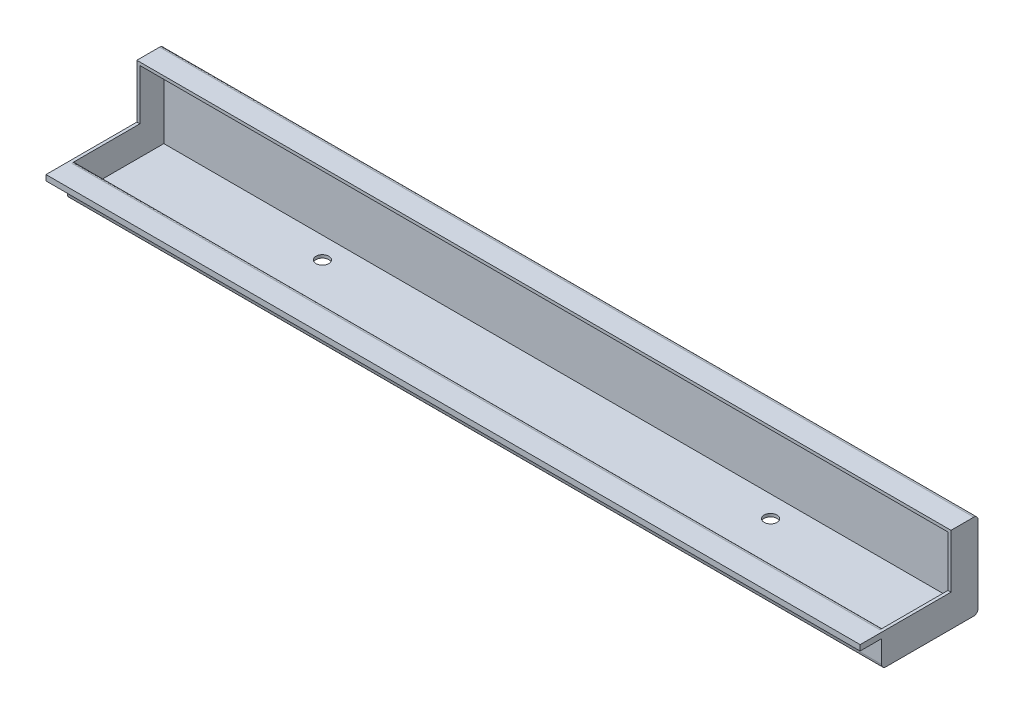
ISO-10303-21;
HEADER;
FILE_DESCRIPTION(('STEP AP214'),'2;1');
FILE_NAME('part.step','',(''),(''),'','','');
FILE_SCHEMA(('AUTOMOTIVE_DESIGN { 1 0 10303 214 1 1 1 1 }'));
ENDSEC;
DATA;
#1=APPLICATION_CONTEXT('core data for automotive mechanical design processes');
#2=APPLICATION_PROTOCOL_DEFINITION('international standard','automotive_design',2000,#1);
#3=PRODUCT_CONTEXT('',#1,'mechanical');
#4=PRODUCT('Part','Part','',(#3));
#5=PRODUCT_RELATED_PRODUCT_CATEGORY('part','',(#4));
#6=PRODUCT_DEFINITION_FORMATION('','',#4);
#7=PRODUCT_DEFINITION_CONTEXT('part definition',#1,'design');
#8=PRODUCT_DEFINITION('design','',#6,#7);
#9=PRODUCT_DEFINITION_SHAPE('','',#8);
#10=(LENGTH_UNIT() NAMED_UNIT(*) SI_UNIT(.MILLI.,.METRE.));
#11=(NAMED_UNIT(*) PLANE_ANGLE_UNIT() SI_UNIT($,.RADIAN.));
#12=(NAMED_UNIT(*) SI_UNIT($,.STERADIAN.) SOLID_ANGLE_UNIT());
#13=UNCERTAINTY_MEASURE_WITH_UNIT(LENGTH_MEASURE(1.E-05),#10,'distance_accuracy_value','');
#14=(GEOMETRIC_REPRESENTATION_CONTEXT(3) GLOBAL_UNCERTAINTY_ASSIGNED_CONTEXT((#13)) GLOBAL_UNIT_ASSIGNED_CONTEXT((#10,
#11,#12)) REPRESENTATION_CONTEXT('',''));
#15=CARTESIAN_POINT('',(0.,0.,0.));
#16=DIRECTION('',(0.,0.,1.));
#17=DIRECTION('',(1.,0.,0.));
#18=AXIS2_PLACEMENT_3D('',#15,#16,#17);
#19=CARTESIAN_POINT('',(0.,-23.622,0.));
#20=DIRECTION('',(0.,1.,0.));
#21=DIRECTION('',(0.,0.,1.));
#22=AXIS2_PLACEMENT_3D('',#19,#20,#21);
#23=PLANE('',#22);
#24=CARTESIAN_POINT('',(132.842,-23.622,14.4780000000006));
#25=DIRECTION('',(0.,-1.,0.));
#26=DIRECTION('',(0.,0.,-1.));
#27=AXIS2_PLACEMENT_3D('',#24,#25,#26);
#28=CIRCLE('',#27,3.81000000000002);
#29=CARTESIAN_POINT('',(132.842,-23.622,10.6680000000006));
#30=VERTEX_POINT('',#29);
#31=EDGE_CURVE('E297',#30,#30,#28,.T.);
#32=ORIENTED_EDGE('',*,*,#31,.T.);
#33=EDGE_LOOP('',(#32));
#34=FACE_BOUND('',#33,.T.);
#35=DIRECTION('',(1.,0.,0.));
#36=VECTOR('',#35,1.);
#37=CARTESIAN_POINT('',(0.,-23.622,53.848));
#38=LINE('',#37,#36);
#39=CARTESIAN_POINT('',(-239.522,-23.622,53.848));
#40=VERTEX_POINT('',#39);
#41=CARTESIAN_POINT('',(239.522,-23.6220000000009,53.848));
#42=VERTEX_POINT('',#41);
#43=EDGE_CURVE('E189',#40,#42,#38,.T.);
#44=ORIENTED_EDGE('',*,*,#43,.T.);
#45=DIRECTION('',(0.,0.,-1.));
#46=VECTOR('',#45,1.);
#47=CARTESIAN_POINT('',(239.522,-23.622,69.85));
#48=LINE('',#47,#46);
#49=CARTESIAN_POINT('',(239.522,-23.622,1.778));
#50=VERTEX_POINT('',#49);
#51=EDGE_CURVE('E170',#42,#50,#48,.T.);
#52=ORIENTED_EDGE('',*,*,#51,.T.);
#53=DIRECTION('',(1.,0.,0.));
#54=VECTOR('',#53,1.);
#55=CARTESIAN_POINT('',(0.,-23.622,1.778));
#56=LINE('',#55,#54);
#57=CARTESIAN_POINT('',(-239.522,-23.622,1.778));
#58=VERTEX_POINT('',#57);
#59=EDGE_CURVE('E183',#58,#50,#56,.T.);
#60=ORIENTED_EDGE('',*,*,#59,.F.);
#61=DIRECTION('',(0.,0.,-1.));
#62=VECTOR('',#61,1.);
#63=CARTESIAN_POINT('',(-239.522,-23.622,69.85));
#64=LINE('',#63,#62);
#65=EDGE_CURVE('E182',#40,#58,#64,.T.);
#66=ORIENTED_EDGE('',*,*,#65,.F.);
#67=EDGE_LOOP('',(#44,#52,#60,#66));
#68=FACE_BOUND('',#67,.T.);
#69=CARTESIAN_POINT('',(-132.842,-23.622,14.478));
#70=DIRECTION('',(0.,1.,0.));
#71=DIRECTION('',(0.,0.,1.));
#72=AXIS2_PLACEMENT_3D('',#69,#70,#71);
#73=CIRCLE('',#72,3.81000000000001);
#74=CARTESIAN_POINT('',(-132.842,-23.622,18.288));
#75=VERTEX_POINT('',#74);
#76=EDGE_CURVE('E290',#75,#75,#73,.T.);
#77=ORIENTED_EDGE('',*,*,#76,.F.);
#78=EDGE_LOOP('',(#77));
#79=FACE_BOUND('',#78,.T.);
#80=ADVANCED_FACE('F41',(#34,#68,#79),#23,.T.);
#81=CARTESIAN_POINT('',(-241.3,-25.4,69.85));
#82=DIRECTION('',(0.,1.,0.));
#83=DIRECTION('',(0.,0.,1.));
#84=AXIS2_PLACEMENT_3D('',#81,#82,#83);
#85=PLANE('',#84);
#86=DIRECTION('',(0.,0.,-1.));
#87=VECTOR('',#86,1.);
#88=CARTESIAN_POINT('',(241.3,-25.4,69.85));
#89=LINE('',#88,#87);
#90=CARTESIAN_POINT('',(241.3,-25.4,54.61));
#91=VERTEX_POINT('',#90);
#92=CARTESIAN_POINT('',(241.3,-25.4,2.54));
#93=VERTEX_POINT('',#92);
#94=EDGE_CURVE('E223',#91,#93,#89,.T.);
#95=ORIENTED_EDGE('',*,*,#94,.F.);
#96=DIRECTION('',(1.,0.,0.));
#97=VECTOR('',#96,1.);
#98=CARTESIAN_POINT('',(-241.3,-25.4,54.61));
#99=LINE('',#98,#97);
#100=CARTESIAN_POINT('',(-241.3,-25.4,54.61));
#101=VERTEX_POINT('',#100);
#102=EDGE_CURVE('E266',#91,#101,#99,.F.);
#103=ORIENTED_EDGE('',*,*,#102,.T.);
#104=DIRECTION('',(0.,0.,-1.));
#105=VECTOR('',#104,1.);
#106=CARTESIAN_POINT('',(-241.3,-25.4,69.85));
#107=LINE('',#106,#105);
#108=CARTESIAN_POINT('',(-241.3,-25.4,2.54));
#109=VERTEX_POINT('',#108);
#110=EDGE_CURVE('E232',#101,#109,#107,.T.);
#111=ORIENTED_EDGE('',*,*,#110,.T.);
#112=DIRECTION('',(1.,0.,0.));
#113=VECTOR('',#112,1.);
#114=CARTESIAN_POINT('',(241.3,-25.4,2.54));
#115=LINE('',#114,#113);
#116=EDGE_CURVE('E262',#109,#93,#115,.T.);
#117=ORIENTED_EDGE('',*,*,#116,.T.);
#118=EDGE_LOOP('',(#95,#103,#111,#117));
#119=FACE_BOUND('',#118,.T.);
#120=CARTESIAN_POINT('',(132.842,-25.4,14.4780000000006));
#121=DIRECTION('',(0.,1.,0.));
#122=DIRECTION('',(0.,0.,1.));
#123=AXIS2_PLACEMENT_3D('',#120,#121,#122);
#124=CIRCLE('',#123,3.81000000000002);
#125=CARTESIAN_POINT('',(132.842,-25.4,18.2880000000006));
#126=VERTEX_POINT('',#125);
#127=EDGE_CURVE('E287',#126,#126,#124,.F.);
#128=ORIENTED_EDGE('',*,*,#127,.F.);
#129=EDGE_LOOP('',(#128));
#130=FACE_BOUND('',#129,.T.);
#131=CARTESIAN_POINT('',(-132.842,-25.4,14.478));
#132=DIRECTION('',(0.,1.,0.));
#133=DIRECTION('',(0.,0.,1.));
#134=AXIS2_PLACEMENT_3D('',#131,#132,#133);
#135=CIRCLE('',#134,3.81000000000001);
#136=CARTESIAN_POINT('',(-132.842,-25.4,18.288));
#137=VERTEX_POINT('',#136);
#138=EDGE_CURVE('E45',#137,#137,#135,.T.);
#139=ORIENTED_EDGE('',*,*,#138,.T.);
#140=EDGE_LOOP('',(#139));
#141=FACE_BOUND('',#140,.T.);
#142=ADVANCED_FACE('F406',(#119,#130,#141),#85,.F.);
#143=CARTESIAN_POINT('',(0.,-23.622,53.848));
#144=DIRECTION('',(0.,0.,1.));
#145=DIRECTION('',(1.,0.,0.));
#146=AXIS2_PLACEMENT_3D('',#143,#144,#145);
#147=PLANE('',#146);
#148=DIRECTION('',(0.,1.,0.));
#149=VECTOR('',#148,1.);
#150=CARTESIAN_POINT('',(-239.522,0.,53.848));
#151=LINE('',#150,#149);
#152=CARTESIAN_POINT('',(-239.522,-8.89,53.848));
#153=VERTEX_POINT('',#152);
#154=EDGE_CURVE('E309',#40,#153,#151,.T.);
#155=ORIENTED_EDGE('',*,*,#154,.T.);
#156=DIRECTION('',(-1.,0.,0.));
#157=VECTOR('',#156,1.);
#158=CARTESIAN_POINT('',(239.522,-8.89,53.848));
#159=LINE('',#158,#157);
#160=CARTESIAN_POINT('',(239.522,-8.89,53.848));
#161=VERTEX_POINT('',#160);
#162=EDGE_CURVE('E191',#153,#161,#159,.F.);
#163=ORIENTED_EDGE('',*,*,#162,.T.);
#164=DIRECTION('',(0.,1.,0.));
#165=VECTOR('',#164,1.);
#166=CARTESIAN_POINT('',(239.522,-23.6220000000009,53.848));
#167=LINE('',#166,#165);
#168=EDGE_CURVE('E173',#42,#161,#167,.T.);
#169=ORIENTED_EDGE('',*,*,#168,.F.);
#170=ORIENTED_EDGE('',*,*,#43,.F.);
#171=EDGE_LOOP('',(#155,#163,#169,#170));
#172=FACE_BOUND('',#171,.T.);
#173=ADVANCED_FACE('F188',(#172),#147,.F.);
#174=CARTESIAN_POINT('',(0.,-23.622,16.002));
#175=DIRECTION('',(0.,0.,1.));
#176=DIRECTION('',(1.,0.,0.));
#177=AXIS2_PLACEMENT_3D('',#174,#175,#176);
#178=PLANE('',#177);
#179=DIRECTION('',(-1.,0.,0.));
#180=VECTOR('',#179,1.);
#181=CARTESIAN_POINT('',(0.,-6.34999999999999,16.002));
#182=LINE('',#181,#180);
#183=CARTESIAN_POINT('',(241.3,-6.35000000000093,16.002));
#184=VERTEX_POINT('',#183);
#185=CARTESIAN_POINT('',(239.522,-6.35000000000092,16.002));
#186=VERTEX_POINT('',#185);
#187=EDGE_CURVE('E193',#184,#186,#182,.T.);
#188=ORIENTED_EDGE('',*,*,#187,.F.);
#189=DIRECTION('',(0.,1.,0.));
#190=VECTOR('',#189,1.);
#191=CARTESIAN_POINT('',(241.3,-23.622,16.002));
#192=LINE('',#191,#190);
#193=CARTESIAN_POINT('',(241.3,25.4,16.002));
#194=VERTEX_POINT('',#193);
#195=EDGE_CURVE('E199',#184,#194,#192,.T.);
#196=ORIENTED_EDGE('',*,*,#195,.T.);
#197=DIRECTION('',(1.,0.,0.));
#198=VECTOR('',#197,1.);
#199=CARTESIAN_POINT('',(0.,25.4,16.002));
#200=LINE('',#199,#198);
#201=CARTESIAN_POINT('',(-241.3,25.4,16.002));
#202=VERTEX_POINT('',#201);
#203=EDGE_CURVE('E200',#202,#194,#200,.T.);
#204=ORIENTED_EDGE('',*,*,#203,.F.);
#205=DIRECTION('',(0.,1.,0.));
#206=VECTOR('',#205,1.);
#207=CARTESIAN_POINT('',(-241.3,-23.622,16.002));
#208=LINE('',#207,#206);
#209=CARTESIAN_POINT('',(-241.3,-6.34999999999999,16.002));
#210=VERTEX_POINT('',#209);
#211=EDGE_CURVE('E204',#210,#202,#208,.T.);
#212=ORIENTED_EDGE('',*,*,#211,.F.);
#213=DIRECTION('',(1.,0.,0.));
#214=VECTOR('',#213,1.);
#215=CARTESIAN_POINT('',(0.,-6.34999999999999,16.002));
#216=LINE('',#215,#214);
#217=CARTESIAN_POINT('',(-239.522,-6.34999999999999,16.002));
#218=VERTEX_POINT('',#217);
#219=EDGE_CURVE('E315',#210,#218,#216,.T.);
#220=ORIENTED_EDGE('',*,*,#219,.T.);
#221=DIRECTION('',(0.,1.,0.));
#222=VECTOR('',#221,1.);
#223=CARTESIAN_POINT('',(-239.522,-23.622,16.002));
#224=LINE('',#223,#222);
#225=CARTESIAN_POINT('',(-239.522,23.622,16.002));
#226=VERTEX_POINT('',#225);
#227=EDGE_CURVE('E323',#218,#226,#224,.T.);
#228=ORIENTED_EDGE('',*,*,#227,.T.);
#229=DIRECTION('',(1.,0.,0.));
#230=VECTOR('',#229,1.);
#231=CARTESIAN_POINT('',(0.,23.622,16.002));
#232=LINE('',#231,#230);
#233=CARTESIAN_POINT('',(239.522,23.622,16.002));
#234=VERTEX_POINT('',#233);
#235=EDGE_CURVE('E318',#226,#234,#232,.T.);
#236=ORIENTED_EDGE('',*,*,#235,.T.);
#237=DIRECTION('',(0.,1.,0.));
#238=VECTOR('',#237,1.);
#239=CARTESIAN_POINT('',(239.522,-25.4,16.002));
#240=LINE('',#239,#238);
#241=EDGE_CURVE('E342',#186,#234,#240,.T.);
#242=ORIENTED_EDGE('',*,*,#241,.F.);
#243=EDGE_LOOP('',(#188,#196,#204,#212,#220,#228,#236,#242));
#244=FACE_BOUND('',#243,.T.);
#245=ADVANCED_FACE('F387',(#244),#178,.T.);
#246=CARTESIAN_POINT('',(241.3,-25.4,69.85));
#247=DIRECTION('',(-1.,0.,0.));
#248=DIRECTION('',(0.,0.,1.));
#249=AXIS2_PLACEMENT_3D('',#246,#247,#248);
#250=PLANE('',#249);
#251=DIRECTION('',(0.,1.,0.));
#252=VECTOR('',#251,1.);
#253=CARTESIAN_POINT('',(241.3,-25.4,57.15));
#254=LINE('',#253,#252);
#255=CARTESIAN_POINT('',(241.3,-22.86,57.15));
#256=VERTEX_POINT('',#255);
#257=CARTESIAN_POINT('',(241.3,-9.65199999999999,57.15));
#258=VERTEX_POINT('',#257);
#259=EDGE_CURVE('E354',#256,#258,#254,.T.);
#260=ORIENTED_EDGE('',*,*,#259,.F.);
#261=CARTESIAN_POINT('',(241.3,-22.86,54.61));
#262=DIRECTION('',(-1.,0.,0.));
#263=DIRECTION('',(0.,0.,1.));
#264=AXIS2_PLACEMENT_3D('',#261,#262,#263);
#265=CIRCLE('',#264,2.54);
#266=EDGE_CURVE('E259',#256,#91,#265,.F.);
#267=ORIENTED_EDGE('',*,*,#266,.T.);
#268=ORIENTED_EDGE('',*,*,#94,.T.);
#269=CARTESIAN_POINT('',(241.3,-22.86,2.54));
#270=DIRECTION('',(-1.,0.,0.));
#271=DIRECTION('',(0.,0.,1.));
#272=AXIS2_PLACEMENT_3D('',#269,#270,#271);
#273=CIRCLE('',#272,2.54);
#274=CARTESIAN_POINT('',(241.3,-22.86,0.));
#275=VERTEX_POINT('',#274);
#276=EDGE_CURVE('E256',#93,#275,#273,.F.);
#277=ORIENTED_EDGE('',*,*,#276,.T.);
#278=DIRECTION('',(0.,1.,0.));
#279=VECTOR('',#278,1.);
#280=CARTESIAN_POINT('',(241.3,-25.4,0.));
#281=LINE('',#280,#279);
#282=CARTESIAN_POINT('',(241.3,22.86,0.));
#283=VERTEX_POINT('',#282);
#284=EDGE_CURVE('E213',#275,#283,#281,.T.);
#285=ORIENTED_EDGE('',*,*,#284,.T.);
#286=CARTESIAN_POINT('',(241.3,22.86,2.54));
#287=DIRECTION('',(-1.,0.,0.));
#288=DIRECTION('',(0.,0.,1.));
#289=AXIS2_PLACEMENT_3D('',#286,#287,#288);
#290=CIRCLE('',#289,2.54);
#291=CARTESIAN_POINT('',(241.3,25.4,2.54));
#292=VERTEX_POINT('',#291);
#293=EDGE_CURVE('E253',#283,#292,#290,.F.);
#294=ORIENTED_EDGE('',*,*,#293,.T.);
#295=DIRECTION('',(0.,0.,-1.));
#296=VECTOR('',#295,1.);
#297=CARTESIAN_POINT('',(241.3,25.4,69.85));
#298=LINE('',#297,#296);
#299=EDGE_CURVE('E239',#194,#292,#298,.T.);
#300=ORIENTED_EDGE('',*,*,#299,.F.);
#301=ORIENTED_EDGE('',*,*,#195,.F.);
#302=DIRECTION('',(0.,0.,-1.));
#303=VECTOR('',#302,1.);
#304=CARTESIAN_POINT('',(241.3,-6.34999999999999,53.848));
#305=LINE('',#304,#303);
#306=CARTESIAN_POINT('',(241.3,-6.34999999999999,69.85));
#307=VERTEX_POINT('',#306);
#308=EDGE_CURVE('E207',#307,#184,#305,.T.);
#309=ORIENTED_EDGE('',*,*,#308,.F.);
#310=DIRECTION('',(0.,1.,0.));
#311=VECTOR('',#310,1.);
#312=CARTESIAN_POINT('',(241.3,-25.4,69.85));
#313=LINE('',#312,#311);
#314=CARTESIAN_POINT('',(241.3,-9.65199999999999,69.85));
#315=VERTEX_POINT('',#314);
#316=EDGE_CURVE('E215',#315,#307,#313,.T.);
#317=ORIENTED_EDGE('',*,*,#316,.F.);
#318=DIRECTION('',(0.,0.,1.));
#319=VECTOR('',#318,1.);
#320=CARTESIAN_POINT('',(241.3,-9.65199999999999,57.15));
#321=LINE('',#320,#319);
#322=EDGE_CURVE('E361',#258,#315,#321,.T.);
#323=ORIENTED_EDGE('',*,*,#322,.F.);
#324=EDGE_LOOP('',(#260,#267,#268,#277,#285,#294,#300,#301,#309,#317,#323));
#325=FACE_BOUND('',#324,.T.);
#326=ADVANCED_FACE('F391',(#325),#250,.F.);
#327=CARTESIAN_POINT('',(-241.3,-25.4,69.85));
#328=DIRECTION('',(1.,0.,0.));
#329=DIRECTION('',(0.,0.,-1.));
#330=AXIS2_PLACEMENT_3D('',#327,#328,#329);
#331=PLANE('',#330);
#332=ORIENTED_EDGE('',*,*,#110,.F.);
#333=CARTESIAN_POINT('',(-241.3,-22.86,54.61));
#334=DIRECTION('',(1.,0.,0.));
#335=DIRECTION('',(0.,0.,-1.));
#336=AXIS2_PLACEMENT_3D('',#333,#334,#335);
#337=CIRCLE('',#336,2.54);
#338=CARTESIAN_POINT('',(-241.3,-22.86,57.15));
#339=VERTEX_POINT('',#338);
#340=EDGE_CURVE('E274',#101,#339,#337,.F.);
#341=ORIENTED_EDGE('',*,*,#340,.T.);
#342=DIRECTION('',(0.,-1.,0.));
#343=VECTOR('',#342,1.);
#344=CARTESIAN_POINT('',(-241.3,-25.4,57.15));
#345=LINE('',#344,#343);
#346=CARTESIAN_POINT('',(-241.3,-9.65199999999999,57.15));
#347=VERTEX_POINT('',#346);
#348=EDGE_CURVE('E350',#347,#339,#345,.T.);
#349=ORIENTED_EDGE('',*,*,#348,.F.);
#350=DIRECTION('',(0.,0.,1.));
#351=VECTOR('',#350,1.);
#352=CARTESIAN_POINT('',(-241.3,-9.65199999999999,57.15));
#353=LINE('',#352,#351);
#354=CARTESIAN_POINT('',(-241.3,-9.65199999999999,69.85));
#355=VERTEX_POINT('',#354);
#356=EDGE_CURVE('E364',#347,#355,#353,.T.);
#357=ORIENTED_EDGE('',*,*,#356,.T.);
#358=DIRECTION('',(0.,-1.,0.));
#359=VECTOR('',#358,1.);
#360=CARTESIAN_POINT('',(-241.3,-25.4,69.85));
#361=LINE('',#360,#359);
#362=CARTESIAN_POINT('',(-241.3,-6.34999999999999,69.85));
#363=VERTEX_POINT('',#362);
#364=EDGE_CURVE('E218',#363,#355,#361,.T.);
#365=ORIENTED_EDGE('',*,*,#364,.F.);
#366=DIRECTION('',(0.,0.,1.));
#367=VECTOR('',#366,1.);
#368=CARTESIAN_POINT('',(-241.3,-6.34999999999999,53.848));
#369=LINE('',#368,#367);
#370=EDGE_CURVE('E368',#210,#363,#369,.T.);
#371=ORIENTED_EDGE('',*,*,#370,.F.);
#372=ORIENTED_EDGE('',*,*,#211,.T.);
#373=DIRECTION('',(0.,0.,-1.));
#374=VECTOR('',#373,1.);
#375=CARTESIAN_POINT('',(-241.3,25.4,69.85));
#376=LINE('',#375,#374);
#377=CARTESIAN_POINT('',(-241.3,25.4,2.54));
#378=VERTEX_POINT('',#377);
#379=EDGE_CURVE('E236',#202,#378,#376,.T.);
#380=ORIENTED_EDGE('',*,*,#379,.T.);
#381=CARTESIAN_POINT('',(-241.3,22.86,2.54));
#382=DIRECTION('',(1.,0.,0.));
#383=DIRECTION('',(0.,0.,-1.));
#384=AXIS2_PLACEMENT_3D('',#381,#382,#383);
#385=CIRCLE('',#384,2.54);
#386=CARTESIAN_POINT('',(-241.3,22.86,0.));
#387=VERTEX_POINT('',#386);
#388=EDGE_CURVE('E66',#378,#387,#385,.F.);
#389=ORIENTED_EDGE('',*,*,#388,.T.);
#390=DIRECTION('',(0.,-1.,0.));
#391=VECTOR('',#390,1.);
#392=CARTESIAN_POINT('',(-241.3,-25.4,0.));
#393=LINE('',#392,#391);
#394=CARTESIAN_POINT('',(-241.3,-22.86,0.));
#395=VERTEX_POINT('',#394);
#396=EDGE_CURVE('E219',#387,#395,#393,.T.);
#397=ORIENTED_EDGE('',*,*,#396,.T.);
#398=CARTESIAN_POINT('',(-241.3,-22.86,2.54));
#399=DIRECTION('',(1.,0.,0.));
#400=DIRECTION('',(0.,0.,-1.));
#401=AXIS2_PLACEMENT_3D('',#398,#399,#400);
#402=CIRCLE('',#401,2.54);
#403=EDGE_CURVE('E271',#395,#109,#402,.F.);
#404=ORIENTED_EDGE('',*,*,#403,.T.);
#405=EDGE_LOOP('',(#332,#341,#349,#357,#365,#371,#372,#380,#389,#397,#404));
#406=FACE_BOUND('',#405,.T.);
#407=ADVANCED_FACE('F411',(#406),#331,.F.);
#408=CARTESIAN_POINT('',(0.,0.,69.85));
#409=DIRECTION('',(0.,0.,-1.));
#410=DIRECTION('',(-1.,0.,0.));
#411=AXIS2_PLACEMENT_3D('',#408,#409,#410);
#412=PLANE('',#411);
#413=ORIENTED_EDGE('',*,*,#364,.T.);
#414=DIRECTION('',(-1.,0.,0.));
#415=VECTOR('',#414,1.);
#416=CARTESIAN_POINT('',(-241.3,-9.65199999999999,69.85));
#417=LINE('',#416,#415);
#418=EDGE_CURVE('E327',#315,#355,#417,.T.);
#419=ORIENTED_EDGE('',*,*,#418,.F.);
#420=ORIENTED_EDGE('',*,*,#316,.T.);
#421=DIRECTION('',(1.,0.,0.));
#422=VECTOR('',#421,1.);
#423=CARTESIAN_POINT('',(-241.3,-6.34999999999999,69.85));
#424=LINE('',#423,#422);
#425=EDGE_CURVE('E372',#363,#307,#424,.T.);
#426=ORIENTED_EDGE('',*,*,#425,.F.);
#427=EDGE_LOOP('',(#413,#419,#420,#426));
#428=FACE_BOUND('',#427,.T.);
#429=ADVANCED_FACE('F424',(#428),#412,.F.);
#430=CARTESIAN_POINT('',(-241.3,25.4,69.85));
#431=DIRECTION('',(0.,-1.,0.));
#432=DIRECTION('',(0.,0.,-1.));
#433=AXIS2_PLACEMENT_3D('',#430,#431,#432);
#434=PLANE('',#433);
#435=ORIENTED_EDGE('',*,*,#299,.T.);
#436=DIRECTION('',(-1.,0.,0.));
#437=VECTOR('',#436,1.);
#438=CARTESIAN_POINT('',(-241.3,25.4,2.54));
#439=LINE('',#438,#437);
#440=EDGE_CURVE('E282',#292,#378,#439,.T.);
#441=ORIENTED_EDGE('',*,*,#440,.T.);
#442=ORIENTED_EDGE('',*,*,#379,.F.);
#443=ORIENTED_EDGE('',*,*,#203,.T.);
#444=EDGE_LOOP('',(#435,#441,#442,#443));
#445=FACE_BOUND('',#444,.T.);
#446=ADVANCED_FACE('F395',(#445),#434,.F.);
#447=CARTESIAN_POINT('',(0.,0.,0.));
#448=DIRECTION('',(0.,0.,-1.));
#449=DIRECTION('',(-1.,0.,0.));
#450=AXIS2_PLACEMENT_3D('',#447,#448,#449);
#451=PLANE('',#450);
#452=ORIENTED_EDGE('',*,*,#284,.F.);
#453=DIRECTION('',(1.,0.,0.));
#454=VECTOR('',#453,1.);
#455=CARTESIAN_POINT('',(-241.3,-22.86,0.));
#456=LINE('',#455,#454);
#457=EDGE_CURVE('E59',#275,#395,#456,.F.);
#458=ORIENTED_EDGE('',*,*,#457,.T.);
#459=ORIENTED_EDGE('',*,*,#396,.F.);
#460=DIRECTION('',(-1.,0.,0.));
#461=VECTOR('',#460,1.);
#462=CARTESIAN_POINT('',(241.3,22.86,0.));
#463=LINE('',#462,#461);
#464=EDGE_CURVE('E277',#387,#283,#463,.F.);
#465=ORIENTED_EDGE('',*,*,#464,.T.);
#466=EDGE_LOOP('',(#452,#458,#459,#465));
#467=FACE_BOUND('',#466,.T.);
#468=ADVANCED_FACE('F399',(#467),#451,.T.);
#469=CARTESIAN_POINT('',(0.,-6.34999999999999,0.));
#470=DIRECTION('',(0.,1.,0.));
#471=DIRECTION('',(0.,0.,1.));
#472=AXIS2_PLACEMENT_3D('',#469,#470,#471);
#473=PLANE('',#472);
#474=DIRECTION('',(-1.,0.,0.));
#475=VECTOR('',#474,1.);
#476=CARTESIAN_POINT('',(-239.522,-6.34999999999999,56.388));
#477=LINE('',#476,#475);
#478=CARTESIAN_POINT('',(239.522,-6.35000000000092,56.388));
#479=VERTEX_POINT('',#478);
#480=CARTESIAN_POINT('',(-239.522,-6.34999999999999,56.388));
#481=VERTEX_POINT('',#480);
#482=EDGE_CURVE('E243',#479,#481,#477,.T.);
#483=ORIENTED_EDGE('',*,*,#482,.T.);
#484=DIRECTION('',(0.,0.,1.));
#485=VECTOR('',#484,1.);
#486=CARTESIAN_POINT('',(-239.522,-6.34999999999999,9.398));
#487=LINE('',#486,#485);
#488=EDGE_CURVE('E312',#218,#481,#487,.T.);
#489=ORIENTED_EDGE('',*,*,#488,.F.);
#490=ORIENTED_EDGE('',*,*,#219,.F.);
#491=ORIENTED_EDGE('',*,*,#370,.T.);
#492=ORIENTED_EDGE('',*,*,#425,.T.);
#493=ORIENTED_EDGE('',*,*,#308,.T.);
#494=ORIENTED_EDGE('',*,*,#187,.T.);
#495=DIRECTION('',(0.,0.,1.));
#496=VECTOR('',#495,1.);
#497=CARTESIAN_POINT('',(239.522,-6.35000000000092,9.398));
#498=LINE('',#497,#496);
#499=EDGE_CURVE('E194',#186,#479,#498,.T.);
#500=ORIENTED_EDGE('',*,*,#499,.T.);
#501=EDGE_LOOP('',(#483,#489,#490,#491,#492,#493,#494,#500));
#502=FACE_BOUND('',#501,.T.);
#503=ADVANCED_FACE('F380',(#502),#473,.T.);
#504=CARTESIAN_POINT('',(-241.3,-9.65199999999999,57.15));
#505=DIRECTION('',(0.,1.,0.));
#506=DIRECTION('',(0.,0.,1.));
#507=AXIS2_PLACEMENT_3D('',#504,#505,#506);
#508=PLANE('',#507);
#509=ORIENTED_EDGE('',*,*,#418,.T.);
#510=ORIENTED_EDGE('',*,*,#356,.F.);
#511=DIRECTION('',(-1.,0.,0.));
#512=VECTOR('',#511,1.);
#513=CARTESIAN_POINT('',(-241.3,-9.65199999999999,57.15));
#514=LINE('',#513,#512);
#515=EDGE_CURVE('E357',#258,#347,#514,.T.);
#516=ORIENTED_EDGE('',*,*,#515,.F.);
#517=ORIENTED_EDGE('',*,*,#322,.T.);
#518=EDGE_LOOP('',(#509,#510,#516,#517));
#519=FACE_BOUND('',#518,.T.);
#520=ADVANCED_FACE('F422',(#519),#508,.F.);
#521=CARTESIAN_POINT('',(0.,0.,57.15));
#522=DIRECTION('',(0.,0.,-1.));
#523=DIRECTION('',(-1.,0.,0.));
#524=AXIS2_PLACEMENT_3D('',#521,#522,#523);
#525=PLANE('',#524);
#526=ORIENTED_EDGE('',*,*,#348,.T.);
#527=DIRECTION('',(1.,0.,0.));
#528=VECTOR('',#527,1.);
#529=CARTESIAN_POINT('',(0.,-22.86,57.15));
#530=LINE('',#529,#528);
#531=EDGE_CURVE('E249',#339,#256,#530,.T.);
#532=ORIENTED_EDGE('',*,*,#531,.T.);
#533=ORIENTED_EDGE('',*,*,#259,.T.);
#534=ORIENTED_EDGE('',*,*,#515,.T.);
#535=EDGE_LOOP('',(#526,#532,#533,#534));
#536=FACE_BOUND('',#535,.T.);
#537=ADVANCED_FACE('F417',(#536),#525,.F.);
#538=CARTESIAN_POINT('',(239.522,-25.4,69.85));
#539=DIRECTION('',(-1.,0.,0.));
#540=DIRECTION('',(0.,0.,1.));
#541=AXIS2_PLACEMENT_3D('',#538,#539,#540);
#542=PLANE('',#541);
#543=ORIENTED_EDGE('',*,*,#51,.F.);
#544=ORIENTED_EDGE('',*,*,#168,.T.);
#545=CARTESIAN_POINT('',(239.522,-8.89,56.388));
#546=DIRECTION('',(-1.,0.,0.));
#547=DIRECTION('',(0.,0.,1.));
#548=AXIS2_PLACEMENT_3D('',#545,#546,#547);
#549=CIRCLE('',#548,2.54);
#550=EDGE_CURVE('E11',#161,#479,#549,.F.);
#551=ORIENTED_EDGE('',*,*,#550,.T.);
#552=ORIENTED_EDGE('',*,*,#499,.F.);
#553=ORIENTED_EDGE('',*,*,#241,.T.);
#554=DIRECTION('',(0.,0.,-1.));
#555=VECTOR('',#554,1.);
#556=CARTESIAN_POINT('',(239.522,23.622,69.85));
#557=LINE('',#556,#555);
#558=CARTESIAN_POINT('',(239.522,23.622,1.778));
#559=VERTEX_POINT('',#558);
#560=EDGE_CURVE('E324',#234,#559,#557,.T.);
#561=ORIENTED_EDGE('',*,*,#560,.T.);
#562=DIRECTION('',(0.,1.,0.));
#563=VECTOR('',#562,1.);
#564=CARTESIAN_POINT('',(239.522,0.,1.778));
#565=LINE('',#564,#563);
#566=EDGE_CURVE('E176',#50,#559,#565,.T.);
#567=ORIENTED_EDGE('',*,*,#566,.F.);
#568=EDGE_LOOP('',(#543,#544,#551,#552,#553,#561,#567));
#569=FACE_BOUND('',#568,.T.);
#570=ADVANCED_FACE('F172',(#569),#542,.T.);
#571=CARTESIAN_POINT('',(-239.522,-25.4,69.85));
#572=DIRECTION('',(1.,0.,0.));
#573=DIRECTION('',(0.,0.,-1.));
#574=AXIS2_PLACEMENT_3D('',#571,#572,#573);
#575=PLANE('',#574);
#576=ORIENTED_EDGE('',*,*,#227,.F.);
#577=ORIENTED_EDGE('',*,*,#488,.T.);
#578=CARTESIAN_POINT('',(-239.522,-8.89,56.388));
#579=DIRECTION('',(1.,0.,0.));
#580=DIRECTION('',(0.,0.,-1.));
#581=AXIS2_PLACEMENT_3D('',#578,#579,#580);
#582=CIRCLE('',#581,2.54);
#583=EDGE_CURVE('E51',#481,#153,#582,.F.);
#584=ORIENTED_EDGE('',*,*,#583,.T.);
#585=ORIENTED_EDGE('',*,*,#154,.F.);
#586=ORIENTED_EDGE('',*,*,#65,.T.);
#587=DIRECTION('',(0.,-1.,0.));
#588=VECTOR('',#587,1.);
#589=CARTESIAN_POINT('',(-239.522,0.,1.778));
#590=LINE('',#589,#588);
#591=CARTESIAN_POINT('',(-239.522,23.622,1.778));
#592=VERTEX_POINT('',#591);
#593=EDGE_CURVE('E331',#592,#58,#590,.T.);
#594=ORIENTED_EDGE('',*,*,#593,.F.);
#595=DIRECTION('',(0.,0.,-1.));
#596=VECTOR('',#595,1.);
#597=CARTESIAN_POINT('',(-239.522,23.622,69.85));
#598=LINE('',#597,#596);
#599=EDGE_CURVE('E328',#226,#592,#598,.T.);
#600=ORIENTED_EDGE('',*,*,#599,.F.);
#601=EDGE_LOOP('',(#576,#577,#584,#585,#586,#594,#600));
#602=FACE_BOUND('',#601,.T.);
#603=ADVANCED_FACE('F431',(#602),#575,.T.);
#604=CARTESIAN_POINT('',(-241.3,23.622,69.85));
#605=DIRECTION('',(0.,-1.,0.));
#606=DIRECTION('',(0.,0.,-1.));
#607=AXIS2_PLACEMENT_3D('',#604,#605,#606);
#608=PLANE('',#607);
#609=ORIENTED_EDGE('',*,*,#235,.F.);
#610=ORIENTED_EDGE('',*,*,#599,.T.);
#611=DIRECTION('',(-1.,0.,0.));
#612=VECTOR('',#611,1.);
#613=CARTESIAN_POINT('',(0.,23.622,1.778));
#614=LINE('',#613,#612);
#615=EDGE_CURVE('E322',#559,#592,#614,.T.);
#616=ORIENTED_EDGE('',*,*,#615,.F.);
#617=ORIENTED_EDGE('',*,*,#560,.F.);
#618=EDGE_LOOP('',(#609,#610,#616,#617));
#619=FACE_BOUND('',#618,.T.);
#620=ADVANCED_FACE('F438',(#619),#608,.T.);
#621=CARTESIAN_POINT('',(0.,0.,1.778));
#622=DIRECTION('',(0.,0.,-1.));
#623=DIRECTION('',(-1.,0.,0.));
#624=AXIS2_PLACEMENT_3D('',#621,#622,#623);
#625=PLANE('',#624);
#626=ORIENTED_EDGE('',*,*,#566,.T.);
#627=ORIENTED_EDGE('',*,*,#615,.T.);
#628=ORIENTED_EDGE('',*,*,#593,.T.);
#629=ORIENTED_EDGE('',*,*,#59,.T.);
#630=EDGE_LOOP('',(#626,#627,#628,#629));
#631=FACE_BOUND('',#630,.T.);
#632=ADVANCED_FACE('F443',(#631),#625,.F.);
#633=CARTESIAN_POINT('',(0.,-8.89,56.388));
#634=DIRECTION('',(1.,0.,0.));
#635=DIRECTION('',(0.,0.,-1.));
#636=AXIS2_PLACEMENT_3D('',#633,#634,#635);
#637=CYLINDRICAL_SURFACE('',#636,2.54);
#638=ORIENTED_EDGE('',*,*,#550,.F.);
#639=ORIENTED_EDGE('',*,*,#162,.F.);
#640=ORIENTED_EDGE('',*,*,#583,.F.);
#641=ORIENTED_EDGE('',*,*,#482,.F.);
#642=EDGE_LOOP('',(#638,#639,#640,#641));
#643=FACE_BOUND('',#642,.T.);
#644=ADVANCED_FACE('F441',(#643),#637,.T.);
#645=CARTESIAN_POINT('',(0.,-22.86,54.61));
#646=DIRECTION('',(1.,0.,0.));
#647=DIRECTION('',(0.,0.,-1.));
#648=AXIS2_PLACEMENT_3D('',#645,#646,#647);
#649=CYLINDRICAL_SURFACE('',#648,2.54);
#650=ORIENTED_EDGE('',*,*,#340,.F.);
#651=ORIENTED_EDGE('',*,*,#102,.F.);
#652=ORIENTED_EDGE('',*,*,#266,.F.);
#653=ORIENTED_EDGE('',*,*,#531,.F.);
#654=EDGE_LOOP('',(#650,#651,#652,#653));
#655=FACE_BOUND('',#654,.T.);
#656=ADVANCED_FACE('F415',(#655),#649,.T.);
#657=CARTESIAN_POINT('',(-241.3,-22.86,2.54));
#658=DIRECTION('',(-1.,0.,0.));
#659=DIRECTION('',(0.,0.,1.));
#660=AXIS2_PLACEMENT_3D('',#657,#658,#659);
#661=CYLINDRICAL_SURFACE('',#660,2.54);
#662=ORIENTED_EDGE('',*,*,#403,.F.);
#663=ORIENTED_EDGE('',*,*,#457,.F.);
#664=ORIENTED_EDGE('',*,*,#276,.F.);
#665=ORIENTED_EDGE('',*,*,#116,.F.);
#666=EDGE_LOOP('',(#662,#663,#664,#665));
#667=FACE_BOUND('',#666,.T.);
#668=ADVANCED_FACE('F404',(#667),#661,.T.);
#669=CARTESIAN_POINT('',(-241.3,22.86,2.54));
#670=DIRECTION('',(1.,0.,0.));
#671=DIRECTION('',(0.,0.,-1.));
#672=AXIS2_PLACEMENT_3D('',#669,#670,#671);
#673=CYLINDRICAL_SURFACE('',#672,2.54);
#674=ORIENTED_EDGE('',*,*,#293,.F.);
#675=ORIENTED_EDGE('',*,*,#464,.F.);
#676=ORIENTED_EDGE('',*,*,#388,.F.);
#677=ORIENTED_EDGE('',*,*,#440,.F.);
#678=EDGE_LOOP('',(#674,#675,#676,#677));
#679=FACE_BOUND('',#678,.T.);
#680=ADVANCED_FACE('F43',(#679),#673,.T.);
#681=CARTESIAN_POINT('',(132.842,-68.072,14.4780000000006));
#682=DIRECTION('',(0.,1.,0.));
#683=DIRECTION('',(0.,0.,1.));
#684=AXIS2_PLACEMENT_3D('',#681,#682,#683);
#685=CYLINDRICAL_SURFACE('',#684,3.81000000000002);
#686=ORIENTED_EDGE('',*,*,#31,.F.);
#687=EDGE_LOOP('',(#686));
#688=FACE_BOUND('',#687,.T.);
#689=ORIENTED_EDGE('',*,*,#127,.T.);
#690=EDGE_LOOP('',(#689));
#691=FACE_BOUND('',#690,.T.);
#692=ADVANCED_FACE('F482',(#688,#691),#685,.F.);
#693=CARTESIAN_POINT('',(-132.842,-68.072,14.478));
#694=DIRECTION('',(0.,1.,0.));
#695=DIRECTION('',(0.,0.,1.));
#696=AXIS2_PLACEMENT_3D('',#693,#694,#695);
#697=CYLINDRICAL_SURFACE('',#696,3.81000000000001);
#698=ORIENTED_EDGE('',*,*,#76,.T.);
#699=EDGE_LOOP('',(#698));
#700=FACE_BOUND('',#699,.T.);
#701=ORIENTED_EDGE('',*,*,#138,.F.);
#702=EDGE_LOOP('',(#701));
#703=FACE_BOUND('',#702,.T.);
#704=ADVANCED_FACE('F486',(#700,#703),#697,.F.);
#705=CLOSED_SHELL('',(#80,#142,#173,#245,#326,#407,#429,#446,#468,#503,#520,#537,#570,#603,#620,
#632,#644,#656,#668,#680,#692,#704));
#706=MANIFOLD_SOLID_BREP('B2',#705);
#707=ADVANCED_BREP_SHAPE_REPRESENTATION('',(#18,#706),#14);
#708=SHAPE_DEFINITION_REPRESENTATION(#9,#707);
ENDSEC;
END-ISO-10303-21;
